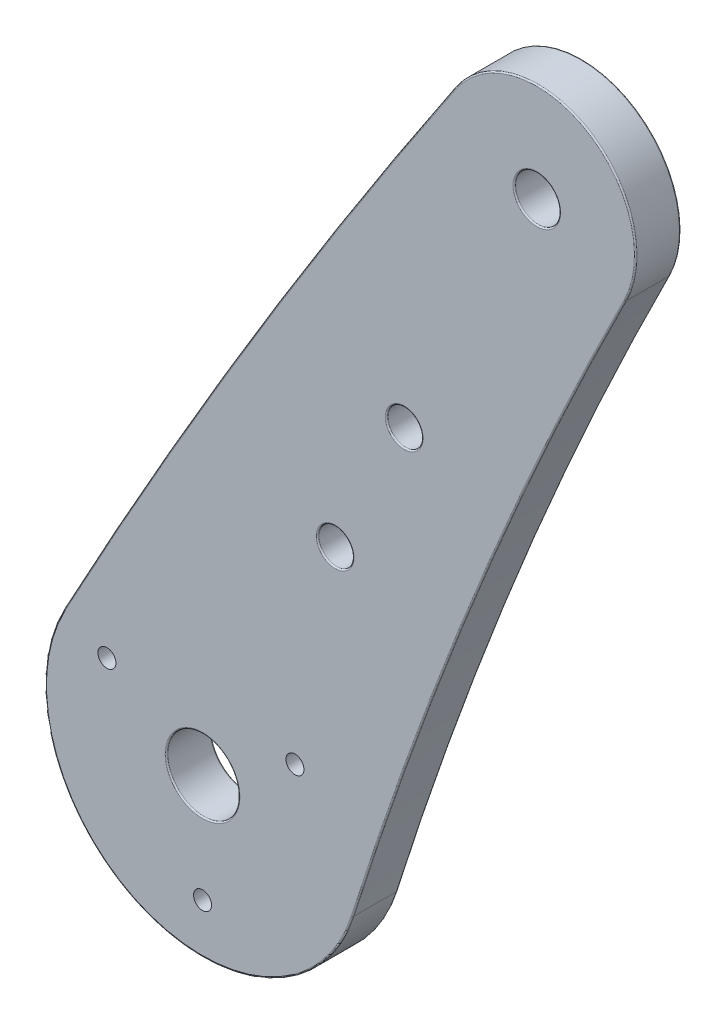
ISO-10303-21;
HEADER;
FILE_DESCRIPTION(('STEP AP214'),'2;1');
FILE_NAME('part.step','',(''),(''),'','','');
FILE_SCHEMA(('AUTOMOTIVE_DESIGN { 1 0 10303 214 1 1 1 1 }'));
ENDSEC;
DATA;
#1=APPLICATION_CONTEXT('core data for automotive mechanical design processes');
#2=APPLICATION_PROTOCOL_DEFINITION('international standard','automotive_design',2000,#1);
#3=PRODUCT_CONTEXT('',#1,'mechanical');
#4=PRODUCT('Part','Part','',(#3));
#5=PRODUCT_RELATED_PRODUCT_CATEGORY('part','',(#4));
#6=PRODUCT_DEFINITION_FORMATION('','',#4);
#7=PRODUCT_DEFINITION_CONTEXT('part definition',#1,'design');
#8=PRODUCT_DEFINITION('design','',#6,#7);
#9=PRODUCT_DEFINITION_SHAPE('','',#8);
#10=(LENGTH_UNIT() NAMED_UNIT(*) SI_UNIT(.MILLI.,.METRE.));
#11=(NAMED_UNIT(*) PLANE_ANGLE_UNIT() SI_UNIT($,.RADIAN.));
#12=(NAMED_UNIT(*) SI_UNIT($,.STERADIAN.) SOLID_ANGLE_UNIT());
#13=UNCERTAINTY_MEASURE_WITH_UNIT(LENGTH_MEASURE(1.E-05),#10,'distance_accuracy_value','');
#14=(GEOMETRIC_REPRESENTATION_CONTEXT(3) GLOBAL_UNCERTAINTY_ASSIGNED_CONTEXT((#13)) GLOBAL_UNIT_ASSIGNED_CONTEXT((#10,
#11,#12)) REPRESENTATION_CONTEXT('',''));
#15=CARTESIAN_POINT('',(0.,0.,0.));
#16=DIRECTION('',(0.,0.,1.));
#17=DIRECTION('',(1.,0.,0.));
#18=AXIS2_PLACEMENT_3D('',#15,#16,#17);
#19=CARTESIAN_POINT('',(245.064855305505,16.5895470184847,5.));
#20=DIRECTION('',(0.,0.,-1.));
#21=DIRECTION('',(-1.,0.,0.));
#22=AXIS2_PLACEMENT_3D('',#19,#20,#21);
#23=PLANE('',#22);
#24=CARTESIAN_POINT('',(-20.22,45.58,5.));
#25=DIRECTION('',(0.,0.,1.));
#26=DIRECTION('',(1.,0.,0.));
#27=AXIS2_PLACEMENT_3D('',#24,#25,#26);
#28=CIRCLE('',#27,1.00000000009273);
#29=CARTESIAN_POINT('',(-19.2199999999072,45.58,5.));
#30=VERTEX_POINT('',#29);
#31=EDGE_CURVE('E218',#30,#30,#28,.T.);
#32=ORIENTED_EDGE('',*,*,#31,.F.);
#33=EDGE_LOOP('',(#32));
#34=FACE_BOUND('',#33,.T.);
#35=CARTESIAN_POINT('',(-30.8485176670294,63.5800000000001,5.));
#36=DIRECTION('',(0.,0.,1.));
#37=DIRECTION('',(1.,0.,0.));
#38=AXIS2_PLACEMENT_3D('',#35,#36,#37);
#39=CIRCLE('',#38,1.00000000009272);
#40=CARTESIAN_POINT('',(-29.8485176669367,63.5800000000001,5.));
#41=VERTEX_POINT('',#40);
#42=EDGE_CURVE('E275',#41,#41,#39,.T.);
#43=ORIENTED_EDGE('',*,*,#42,.F.);
#44=EDGE_LOOP('',(#43));
#45=FACE_BOUND('',#44,.T.);
#46=CARTESIAN_POINT('',(-9.94580156539468,63.7845663042192,5.));
#47=DIRECTION('',(0.,0.,1.));
#48=DIRECTION('',(1.,0.,0.));
#49=AXIS2_PLACEMENT_3D('',#46,#47,#48);
#50=CIRCLE('',#49,1.00000000009271);
#51=CARTESIAN_POINT('',(-8.94580156530197,63.7845663042192,5.));
#52=VERTEX_POINT('',#51);
#53=EDGE_CURVE('E272',#52,#52,#50,.T.);
#54=ORIENTED_EDGE('',*,*,#53,.F.);
#55=EDGE_LOOP('',(#54));
#56=FACE_BOUND('',#55,.T.);
#57=CARTESIAN_POINT('',(-5.48245282163577,86.9566295398349,5.));
#58=DIRECTION('',(0.,0.,-1.));
#59=DIRECTION('',(-1.,0.,0.));
#60=AXIS2_PLACEMENT_3D('',#57,#58,#59);
#61=CIRCLE('',#60,2.09999999999999);
#62=CARTESIAN_POINT('',(-7.58245282163576,86.9566295398349,5.));
#63=VERTEX_POINT('',#62);
#64=EDGE_CURVE('E140',#63,#63,#61,.T.);
#65=ORIENTED_EDGE('',*,*,#64,.T.);
#66=EDGE_LOOP('',(#65));
#67=FACE_BOUND('',#66,.T.);
#68=CARTESIAN_POINT('',(2.20057844504618,102.271360039604,5.));
#69=DIRECTION('',(0.,0.,-1.));
#70=DIRECTION('',(-1.,0.,0.));
#71=AXIS2_PLACEMENT_3D('',#68,#69,#70);
#72=CIRCLE('',#71,2.09999999999999);
#73=CARTESIAN_POINT('',(0.100578445046185,102.271360039604,5.));
#74=VERTEX_POINT('',#73);
#75=EDGE_CURVE('E137',#74,#74,#72,.T.);
#76=ORIENTED_EDGE('',*,*,#75,.T.);
#77=EDGE_LOOP('',(#76));
#78=FACE_BOUND('',#77,.T.);
#79=CARTESIAN_POINT('',(16.9381256234104,131.647989579439,5.));
#80=DIRECTION('',(0.,0.,-1.));
#81=DIRECTION('',(-1.,0.,0.));
#82=AXIS2_PLACEMENT_3D('',#79,#80,#81);
#83=CIRCLE('',#82,2.65);
#84=CARTESIAN_POINT('',(14.2881256234104,131.647989579439,5.));
#85=VERTEX_POINT('',#84);
#86=EDGE_CURVE('E134',#85,#85,#83,.T.);
#87=ORIENTED_EDGE('',*,*,#86,.T.);
#88=EDGE_LOOP('',(#87));
#89=FACE_BOUND('',#88,.T.);
#90=CARTESIAN_POINT('',(473.1915849876,-98.4688955424697,5.));
#91=DIRECTION('',(0.,0.,-1.));
#92=DIRECTION('',(-1.,0.,0.));
#93=AXIS2_PLACEMENT_3D('',#90,#91,#92);
#94=CIRCLE('',#93,500.15);
#95=CARTESIAN_POINT('',(-3.6776019332659,52.3482157726341,5.));
#96=VERTEX_POINT('',#95);
#97=CARTESIAN_POINT('',(26.6256990756636,126.761946128221,5.));
#98=VERTEX_POINT('',#97);
#99=EDGE_CURVE('E104',#96,#98,#94,.T.);
#100=ORIENTED_EDGE('',*,*,#99,.T.);
#101=CARTESIAN_POINT('',(16.9381256234104,131.647989579439,5.));
#102=DIRECTION('',(0.,0.,-1.));
#103=DIRECTION('',(-1.,0.,0.));
#104=AXIS2_PLACEMENT_3D('',#101,#102,#103);
#105=CIRCLE('',#104,10.8499999999996);
#106=CARTESIAN_POINT('',(7.93969256073389,137.710225339991,5.));
#107=VERTEX_POINT('',#106);
#108=EDGE_CURVE('E132',#98,#107,#105,.F.);
#109=ORIENTED_EDGE('',*,*,#108,.T.);
#110=CARTESIAN_POINT('',(712.761659225801,-337.127660476196,5.));
#111=DIRECTION('',(0.,0.,-1.));
#112=DIRECTION('',(-1.,0.,0.));
#113=AXIS2_PLACEMENT_3D('',#110,#111,#112);
#114=CIRCLE('',#113,849.85);
#115=CARTESIAN_POINT('',(-35.4959540991803,65.8060395306448,5.));
#116=VERTEX_POINT('',#115);
#117=EDGE_CURVE('E107',#107,#116,#114,.F.);
#118=ORIENTED_EDGE('',*,*,#117,.T.);
#119=CARTESIAN_POINT('',(-20.2199999999999,57.5799999999999,5.));
#120=DIRECTION('',(0.,0.,-1.));
#121=DIRECTION('',(-1.,0.,0.));
#122=AXIS2_PLACEMENT_3D('',#119,#120,#121);
#123=CIRCLE('',#122,17.3499999999999);
#124=EDGE_CURVE('E99',#116,#96,#123,.F.);
#125=ORIENTED_EDGE('',*,*,#124,.T.);
#126=EDGE_LOOP('',(#100,#109,#118,#125));
#127=FACE_BOUND('',#126,.T.);
#128=CARTESIAN_POINT('',(-20.22,57.58,5.));
#129=DIRECTION('',(0.,0.,-1.));
#130=DIRECTION('',(-1.,0.,0.));
#131=AXIS2_PLACEMENT_3D('',#128,#129,#130);
#132=CIRCLE('',#131,4.15);
#133=CARTESIAN_POINT('',(-24.37,57.58,5.));
#134=VERTEX_POINT('',#133);
#135=EDGE_CURVE('E124',#134,#134,#132,.T.);
#136=ORIENTED_EDGE('',*,*,#135,.T.);
#137=EDGE_LOOP('',(#136));
#138=FACE_BOUND('',#137,.T.);
#139=ADVANCED_FACE('F33',(#34,#45,#56,#67,#78,#89,#127,#138),#23,.F.);
#140=CARTESIAN_POINT('',(245.064855305505,16.5895470184847,0.));
#141=DIRECTION('',(0.,0.,-1.));
#142=DIRECTION('',(-1.,0.,0.));
#143=AXIS2_PLACEMENT_3D('',#140,#141,#142);
#144=PLANE('',#143);
#145=CARTESIAN_POINT('',(-20.22,45.58,0.));
#146=DIRECTION('',(0.,0.,-1.));
#147=DIRECTION('',(-1.,0.,0.));
#148=AXIS2_PLACEMENT_3D('',#145,#146,#147);
#149=CIRCLE('',#148,1.00000000009273);
#150=CARTESIAN_POINT('',(-21.2200000000927,45.58,0.));
#151=VERTEX_POINT('',#150);
#152=EDGE_CURVE('E37',#151,#151,#149,.T.);
#153=ORIENTED_EDGE('',*,*,#152,.F.);
#154=EDGE_LOOP('',(#153));
#155=FACE_BOUND('',#154,.T.);
#156=CARTESIAN_POINT('',(-30.8485176670294,63.5800000000001,0.));
#157=DIRECTION('',(0.,0.,-1.));
#158=DIRECTION('',(-1.,0.,0.));
#159=AXIS2_PLACEMENT_3D('',#156,#157,#158);
#160=CIRCLE('',#159,1.00000000009272);
#161=CARTESIAN_POINT('',(-31.8485176671221,63.5800000000001,0.));
#162=VERTEX_POINT('',#161);
#163=EDGE_CURVE('E217',#162,#162,#160,.T.);
#164=ORIENTED_EDGE('',*,*,#163,.F.);
#165=EDGE_LOOP('',(#164));
#166=FACE_BOUND('',#165,.T.);
#167=CARTESIAN_POINT('',(-9.94580156539468,63.7845663042192,0.));
#168=DIRECTION('',(0.,0.,-1.));
#169=DIRECTION('',(-1.,0.,0.));
#170=AXIS2_PLACEMENT_3D('',#167,#168,#169);
#171=CIRCLE('',#170,1.00000000009271);
#172=CARTESIAN_POINT('',(-10.9458015654874,63.7845663042192,0.));
#173=VERTEX_POINT('',#172);
#174=EDGE_CURVE('E215',#173,#173,#171,.T.);
#175=ORIENTED_EDGE('',*,*,#174,.F.);
#176=EDGE_LOOP('',(#175));
#177=FACE_BOUND('',#176,.T.);
#178=CARTESIAN_POINT('',(2.20057844504618,102.271360039604,0.));
#179=DIRECTION('',(0.,0.,-1.));
#180=DIRECTION('',(-1.,0.,0.));
#181=AXIS2_PLACEMENT_3D('',#178,#179,#180);
#182=CIRCLE('',#181,2.09999999999999);
#183=CARTESIAN_POINT('',(0.100578445046185,102.271360039604,0.));
#184=VERTEX_POINT('',#183);
#185=EDGE_CURVE('E173',#184,#184,#182,.F.);
#186=ORIENTED_EDGE('',*,*,#185,.T.);
#187=EDGE_LOOP('',(#186));
#188=FACE_BOUND('',#187,.T.);
#189=CARTESIAN_POINT('',(-5.48245282163577,86.9566295398349,0.));
#190=DIRECTION('',(0.,0.,-1.));
#191=DIRECTION('',(-1.,0.,0.));
#192=AXIS2_PLACEMENT_3D('',#189,#190,#191);
#193=CIRCLE('',#192,2.09999999999999);
#194=CARTESIAN_POINT('',(-7.58245282163576,86.9566295398349,0.));
#195=VERTEX_POINT('',#194);
#196=EDGE_CURVE('E170',#195,#195,#193,.F.);
#197=ORIENTED_EDGE('',*,*,#196,.T.);
#198=EDGE_LOOP('',(#197));
#199=FACE_BOUND('',#198,.T.);
#200=CARTESIAN_POINT('',(16.9381256234104,131.647989579439,0.));
#201=DIRECTION('',(0.,0.,-1.));
#202=DIRECTION('',(-1.,0.,0.));
#203=AXIS2_PLACEMENT_3D('',#200,#201,#202);
#204=CIRCLE('',#203,2.65);
#205=CARTESIAN_POINT('',(14.2881256234104,131.647989579439,0.));
#206=VERTEX_POINT('',#205);
#207=EDGE_CURVE('E167',#206,#206,#204,.F.);
#208=ORIENTED_EDGE('',*,*,#207,.T.);
#209=EDGE_LOOP('',(#208));
#210=FACE_BOUND('',#209,.T.);
#211=CARTESIAN_POINT('',(-20.22,57.58,0.));
#212=DIRECTION('',(0.,0.,-1.));
#213=DIRECTION('',(-1.,0.,0.));
#214=AXIS2_PLACEMENT_3D('',#211,#212,#213);
#215=CIRCLE('',#214,4.15);
#216=CARTESIAN_POINT('',(-24.37,57.58,0.));
#217=VERTEX_POINT('',#216);
#218=EDGE_CURVE('E164',#217,#217,#215,.F.);
#219=ORIENTED_EDGE('',*,*,#218,.T.);
#220=EDGE_LOOP('',(#219));
#221=FACE_BOUND('',#220,.T.);
#222=CARTESIAN_POINT('',(712.761659225801,-337.127660476196,0.));
#223=DIRECTION('',(0.,0.,-1.));
#224=DIRECTION('',(-1.,0.,0.));
#225=AXIS2_PLACEMENT_3D('',#222,#223,#224);
#226=CIRCLE('',#225,849.85);
#227=CARTESIAN_POINT('',(-35.4959540991803,65.8060395306448,0.));
#228=VERTEX_POINT('',#227);
#229=CARTESIAN_POINT('',(7.93969256073389,137.710225339991,0.));
#230=VERTEX_POINT('',#229);
#231=EDGE_CURVE('E159',#228,#230,#226,.T.);
#232=ORIENTED_EDGE('',*,*,#231,.T.);
#233=CARTESIAN_POINT('',(16.9381256234104,131.647989579439,0.));
#234=DIRECTION('',(0.,0.,-1.));
#235=DIRECTION('',(-1.,0.,0.));
#236=AXIS2_PLACEMENT_3D('',#233,#234,#235);
#237=CIRCLE('',#236,10.8499999999996);
#238=CARTESIAN_POINT('',(26.6256990756636,126.761946128221,0.));
#239=VERTEX_POINT('',#238);
#240=EDGE_CURVE('E161',#230,#239,#237,.T.);
#241=ORIENTED_EDGE('',*,*,#240,.T.);
#242=CARTESIAN_POINT('',(473.1915849876,-98.4688955424697,0.));
#243=DIRECTION('',(0.,0.,-1.));
#244=DIRECTION('',(-1.,0.,0.));
#245=AXIS2_PLACEMENT_3D('',#242,#243,#244);
#246=CIRCLE('',#245,500.15);
#247=CARTESIAN_POINT('',(-3.6776019332659,52.3482157726341,0.));
#248=VERTEX_POINT('',#247);
#249=EDGE_CURVE('E155',#239,#248,#246,.F.);
#250=ORIENTED_EDGE('',*,*,#249,.T.);
#251=CARTESIAN_POINT('',(-20.2199999999999,57.5799999999999,0.));
#252=DIRECTION('',(0.,0.,-1.));
#253=DIRECTION('',(-1.,0.,0.));
#254=AXIS2_PLACEMENT_3D('',#251,#252,#253);
#255=CIRCLE('',#254,17.3499999999999);
#256=EDGE_CURVE('E157',#248,#228,#255,.T.);
#257=ORIENTED_EDGE('',*,*,#256,.T.);
#258=EDGE_LOOP('',(#232,#241,#250,#257));
#259=FACE_BOUND('',#258,.T.);
#260=ADVANCED_FACE('F228',(#155,#166,#177,#188,#199,#210,#221,#259),#144,.T.);
#261=CARTESIAN_POINT('',(16.9381256234104,131.647989579439,5.));
#262=DIRECTION('',(0.,0.,-1.));
#263=DIRECTION('',(-1.,0.,0.));
#264=AXIS2_PLACEMENT_3D('',#261,#262,#263);
#265=CYLINDRICAL_SURFACE('',#264,10.9999999999996);
#266=DIRECTION('',(0.,0.,-1.));
#267=VECTOR('',#266,1.);
#268=CARTESIAN_POINT('',(26.7596286625612,126.694397140416,5.));
#269=LINE('',#268,#267);
#270=CARTESIAN_POINT('',(26.7596286625612,126.694397140416,4.85));
#271=VERTEX_POINT('',#270);
#272=CARTESIAN_POINT('',(26.7596286625612,126.694397140416,0.15));
#273=VERTEX_POINT('',#272);
#274=EDGE_CURVE('E210',#271,#273,#269,.T.);
#275=ORIENTED_EDGE('',*,*,#274,.T.);
#276=CARTESIAN_POINT('',(16.9381256234104,131.647989579439,0.15));
#277=DIRECTION('',(0.,0.,-1.));
#278=DIRECTION('',(-1.,0.,0.));
#279=AXIS2_PLACEMENT_3D('',#276,#277,#278);
#280=CIRCLE('',#279,10.9999999999996);
#281=CARTESIAN_POINT('',(7.81529026032812,137.794035050967,0.15));
#282=VERTEX_POINT('',#281);
#283=EDGE_CURVE('E191',#273,#282,#280,.F.);
#284=ORIENTED_EDGE('',*,*,#283,.T.);
#285=DIRECTION('',(0.,0.,-1.));
#286=VECTOR('',#285,1.);
#287=CARTESIAN_POINT('',(7.81529026032812,137.794035050967,5.));
#288=LINE('',#287,#286);
#289=CARTESIAN_POINT('',(7.81529026032812,137.794035050967,4.85));
#290=VERTEX_POINT('',#289);
#291=EDGE_CURVE('E127',#290,#282,#288,.T.);
#292=ORIENTED_EDGE('',*,*,#291,.F.);
#293=CARTESIAN_POINT('',(16.9381256234104,131.647989579439,4.85));
#294=DIRECTION('',(0.,0.,-1.));
#295=DIRECTION('',(-1.,0.,0.));
#296=AXIS2_PLACEMENT_3D('',#293,#294,#295);
#297=CIRCLE('',#296,10.9999999999996);
#298=EDGE_CURVE('E188',#290,#271,#297,.T.);
#299=ORIENTED_EDGE('',*,*,#298,.T.);
#300=EDGE_LOOP('',(#275,#284,#292,#299));
#301=FACE_BOUND('',#300,.T.);
#302=ADVANCED_FACE('F231',(#301),#265,.T.);
#303=CARTESIAN_POINT('',(712.761659225801,-337.127660476196,5.));
#304=DIRECTION('',(0.,0.,-1.));
#305=DIRECTION('',(-1.,0.,0.));
#306=AXIS2_PLACEMENT_3D('',#303,#304,#305);
#307=CYLINDRICAL_SURFACE('',#306,850.);
#308=ORIENTED_EDGE('',*,*,#291,.T.);
#309=CARTESIAN_POINT('',(712.761659225801,-337.127660476196,0.15));
#310=DIRECTION('',(0.,0.,-1.));
#311=DIRECTION('',(-1.,0.,0.));
#312=AXIS2_PLACEMENT_3D('',#309,#310,#311);
#313=CIRCLE('',#312,850.);
#314=CARTESIAN_POINT('',(-35.6280228666082,65.8771580280277,0.15));
#315=VERTEX_POINT('',#314);
#316=EDGE_CURVE('E196',#282,#315,#313,.F.);
#317=ORIENTED_EDGE('',*,*,#316,.T.);
#318=DIRECTION('',(0.,0.,-1.));
#319=VECTOR('',#318,1.);
#320=CARTESIAN_POINT('',(-35.6280228666082,65.8771580280277,5.));
#321=LINE('',#320,#319);
#322=CARTESIAN_POINT('',(-35.6280228666082,65.8771580280277,4.85));
#323=VERTEX_POINT('',#322);
#324=EDGE_CURVE('E266',#323,#315,#321,.T.);
#325=ORIENTED_EDGE('',*,*,#324,.F.);
#326=CARTESIAN_POINT('',(712.761659225801,-337.127660476196,4.85));
#327=DIRECTION('',(0.,0.,-1.));
#328=DIRECTION('',(-1.,0.,0.));
#329=AXIS2_PLACEMENT_3D('',#326,#327,#328);
#330=CIRCLE('',#329,850.);
#331=EDGE_CURVE('E194',#323,#290,#330,.T.);
#332=ORIENTED_EDGE('',*,*,#331,.T.);
#333=EDGE_LOOP('',(#308,#317,#325,#332));
#334=FACE_BOUND('',#333,.T.);
#335=ADVANCED_FACE('F264',(#334),#307,.T.);
#336=CARTESIAN_POINT('',(-20.2199999999999,57.5799999999999,5.));
#337=DIRECTION('',(0.,0.,-1.));
#338=DIRECTION('',(-1.,0.,0.));
#339=AXIS2_PLACEMENT_3D('',#336,#337,#338);
#340=CYLINDRICAL_SURFACE('',#339,17.4999999999999);
#341=ORIENTED_EDGE('',*,*,#324,.T.);
#342=CARTESIAN_POINT('',(-20.2199999999999,57.5799999999999,0.15));
#343=DIRECTION('',(0.,0.,-1.));
#344=DIRECTION('',(-1.,0.,0.));
#345=AXIS2_PLACEMENT_3D('',#342,#343,#344);
#346=CIRCLE('',#345,17.4999999999999);
#347=CARTESIAN_POINT('',(-3.53458408254486,52.3029842087087,0.15));
#348=VERTEX_POINT('',#347);
#349=EDGE_CURVE('E50',#315,#348,#346,.F.);
#350=ORIENTED_EDGE('',*,*,#349,.T.);
#351=DIRECTION('',(0.,0.,-1.));
#352=VECTOR('',#351,1.);
#353=CARTESIAN_POINT('',(-3.53458408254486,52.3029842087087,5.));
#354=LINE('',#353,#352);
#355=CARTESIAN_POINT('',(-3.53458408254486,52.3029842087087,4.85));
#356=VERTEX_POINT('',#355);
#357=EDGE_CURVE('E267',#356,#348,#354,.T.);
#358=ORIENTED_EDGE('',*,*,#357,.F.);
#359=CARTESIAN_POINT('',(-20.2199999999999,57.5799999999999,4.85));
#360=DIRECTION('',(0.,0.,-1.));
#361=DIRECTION('',(-1.,0.,0.));
#362=AXIS2_PLACEMENT_3D('',#359,#360,#361);
#363=CIRCLE('',#362,17.4999999999999);
#364=EDGE_CURVE('E116',#356,#323,#363,.T.);
#365=ORIENTED_EDGE('',*,*,#364,.T.);
#366=EDGE_LOOP('',(#341,#350,#358,#365));
#367=FACE_BOUND('',#366,.T.);
#368=ADVANCED_FACE('F322',(#367),#340,.T.);
#369=CARTESIAN_POINT('',(473.1915849876,-98.4688955424697,5.));
#370=DIRECTION('',(0.,0.,-1.));
#371=DIRECTION('',(-1.,0.,0.));
#372=AXIS2_PLACEMENT_3D('',#369,#370,#371);
#373=CYLINDRICAL_SURFACE('',#372,500.);
#374=ORIENTED_EDGE('',*,*,#357,.T.);
#375=CARTESIAN_POINT('',(473.1915849876,-98.4688955424697,0.15));
#376=DIRECTION('',(0.,0.,-1.));
#377=DIRECTION('',(-1.,0.,0.));
#378=AXIS2_PLACEMENT_3D('',#375,#376,#377);
#379=CIRCLE('',#378,500.);
#380=EDGE_CURVE('E11',#348,#273,#379,.T.);
#381=ORIENTED_EDGE('',*,*,#380,.T.);
#382=ORIENTED_EDGE('',*,*,#274,.F.);
#383=CARTESIAN_POINT('',(473.1915849876,-98.4688955424697,4.85));
#384=DIRECTION('',(0.,0.,-1.));
#385=DIRECTION('',(-1.,0.,0.));
#386=AXIS2_PLACEMENT_3D('',#383,#384,#385);
#387=CIRCLE('',#386,500.);
#388=EDGE_CURVE('E42',#271,#356,#387,.F.);
#389=ORIENTED_EDGE('',*,*,#388,.T.);
#390=EDGE_LOOP('',(#374,#381,#382,#389));
#391=FACE_BOUND('',#390,.T.);
#392=ADVANCED_FACE('F315',(#391),#373,.F.);
#393=CARTESIAN_POINT('',(-20.22,57.58,5.));
#394=DIRECTION('',(0.,0.,-1.));
#395=DIRECTION('',(-1.,0.,0.));
#396=AXIS2_PLACEMENT_3D('',#393,#394,#395);
#397=CYLINDRICAL_SURFACE('',#396,4.);
#398=CARTESIAN_POINT('',(-20.22,57.58,0.15));
#399=DIRECTION('',(0.,0.,-1.));
#400=DIRECTION('',(-1.,0.,0.));
#401=AXIS2_PLACEMENT_3D('',#398,#399,#400);
#402=CIRCLE('',#401,4.);
#403=CARTESIAN_POINT('',(-24.22,57.58,0.15));
#404=VERTEX_POINT('',#403);
#405=EDGE_CURVE('E185',#404,#404,#402,.T.);
#406=ORIENTED_EDGE('',*,*,#405,.T.);
#407=EDGE_LOOP('',(#406));
#408=FACE_BOUND('',#407,.T.);
#409=CARTESIAN_POINT('',(-20.22,57.58,4.85));
#410=DIRECTION('',(0.,0.,-1.));
#411=DIRECTION('',(-1.,0.,0.));
#412=AXIS2_PLACEMENT_3D('',#409,#410,#411);
#413=CIRCLE('',#412,4.);
#414=CARTESIAN_POINT('',(-24.22,57.58,4.85));
#415=VERTEX_POINT('',#414);
#416=EDGE_CURVE('E182',#415,#415,#413,.F.);
#417=ORIENTED_EDGE('',*,*,#416,.T.);
#418=EDGE_LOOP('',(#417));
#419=FACE_BOUND('',#418,.T.);
#420=ADVANCED_FACE('F305',(#408,#419),#397,.F.);
#421=CARTESIAN_POINT('',(16.9381256234104,131.647989579439,5.));
#422=DIRECTION('',(0.,0.,-1.));
#423=DIRECTION('',(-1.,0.,0.));
#424=AXIS2_PLACEMENT_3D('',#421,#422,#423);
#425=CYLINDRICAL_SURFACE('',#424,2.5);
#426=CARTESIAN_POINT('',(16.9381256234104,131.647989579439,0.15));
#427=DIRECTION('',(0.,0.,-1.));
#428=DIRECTION('',(-1.,0.,0.));
#429=AXIS2_PLACEMENT_3D('',#426,#427,#428);
#430=CIRCLE('',#429,2.5);
#431=CARTESIAN_POINT('',(14.4381256234104,131.647989579439,0.15));
#432=VERTEX_POINT('',#431);
#433=EDGE_CURVE('E179',#432,#432,#430,.T.);
#434=ORIENTED_EDGE('',*,*,#433,.T.);
#435=EDGE_LOOP('',(#434));
#436=FACE_BOUND('',#435,.T.);
#437=CARTESIAN_POINT('',(16.9381256234104,131.647989579439,4.85));
#438=DIRECTION('',(0.,0.,-1.));
#439=DIRECTION('',(-1.,0.,0.));
#440=AXIS2_PLACEMENT_3D('',#437,#438,#439);
#441=CIRCLE('',#440,2.5);
#442=CARTESIAN_POINT('',(14.4381256234104,131.647989579439,4.85));
#443=VERTEX_POINT('',#442);
#444=EDGE_CURVE('E176',#443,#443,#441,.F.);
#445=ORIENTED_EDGE('',*,*,#444,.T.);
#446=EDGE_LOOP('',(#445));
#447=FACE_BOUND('',#446,.T.);
#448=ADVANCED_FACE('F302',(#436,#447),#425,.F.);
#449=CARTESIAN_POINT('',(-5.48245282163577,86.9566295398349,0.));
#450=DIRECTION('',(0.,0.,-1.));
#451=DIRECTION('',(-1.,0.,0.));
#452=AXIS2_PLACEMENT_3D('',#449,#450,#451);
#453=CYLINDRICAL_SURFACE('',#452,1.94999999999999);
#454=CARTESIAN_POINT('',(-5.48245282163577,86.9566295398349,4.85));
#455=DIRECTION('',(0.,0.,-1.));
#456=DIRECTION('',(-1.,0.,0.));
#457=AXIS2_PLACEMENT_3D('',#454,#455,#456);
#458=CIRCLE('',#457,1.94999999999999);
#459=CARTESIAN_POINT('',(-7.43245282163576,86.9566295398349,4.85));
#460=VERTEX_POINT('',#459);
#461=EDGE_CURVE('E146',#460,#460,#458,.F.);
#462=ORIENTED_EDGE('',*,*,#461,.T.);
#463=EDGE_LOOP('',(#462));
#464=FACE_BOUND('',#463,.T.);
#465=CARTESIAN_POINT('',(-5.48245282163577,86.9566295398349,0.15));
#466=DIRECTION('',(0.,0.,-1.));
#467=DIRECTION('',(-1.,0.,0.));
#468=AXIS2_PLACEMENT_3D('',#465,#466,#467);
#469=CIRCLE('',#468,1.94999999999999);
#470=CARTESIAN_POINT('',(-7.43245282163576,86.9566295398349,0.15));
#471=VERTEX_POINT('',#470);
#472=EDGE_CURVE('E143',#471,#471,#469,.T.);
#473=ORIENTED_EDGE('',*,*,#472,.T.);
#474=EDGE_LOOP('',(#473));
#475=FACE_BOUND('',#474,.T.);
#476=ADVANCED_FACE('F304',(#464,#475),#453,.F.);
#477=CARTESIAN_POINT('',(2.20057844504618,102.271360039604,0.));
#478=DIRECTION('',(0.,0.,-1.));
#479=DIRECTION('',(-1.,0.,0.));
#480=AXIS2_PLACEMENT_3D('',#477,#478,#479);
#481=CYLINDRICAL_SURFACE('',#480,1.94999999999999);
#482=CARTESIAN_POINT('',(2.20057844504618,102.271360039604,4.85));
#483=DIRECTION('',(0.,0.,-1.));
#484=DIRECTION('',(-1.,0.,0.));
#485=AXIS2_PLACEMENT_3D('',#482,#483,#484);
#486=CIRCLE('',#485,1.94999999999999);
#487=CARTESIAN_POINT('',(0.250578445046185,102.271360039604,4.85));
#488=VERTEX_POINT('',#487);
#489=EDGE_CURVE('E152',#488,#488,#486,.F.);
#490=ORIENTED_EDGE('',*,*,#489,.T.);
#491=EDGE_LOOP('',(#490));
#492=FACE_BOUND('',#491,.T.);
#493=CARTESIAN_POINT('',(2.20057844504618,102.271360039604,0.15));
#494=DIRECTION('',(0.,0.,-1.));
#495=DIRECTION('',(-1.,0.,0.));
#496=AXIS2_PLACEMENT_3D('',#493,#494,#495);
#497=CIRCLE('',#496,1.94999999999999);
#498=CARTESIAN_POINT('',(0.250578445046185,102.271360039604,0.15));
#499=VERTEX_POINT('',#498);
#500=EDGE_CURVE('E149',#499,#499,#497,.T.);
#501=ORIENTED_EDGE('',*,*,#500,.T.);
#502=EDGE_LOOP('',(#501));
#503=FACE_BOUND('',#502,.T.);
#504=ADVANCED_FACE('F312',(#492,#503),#481,.F.);
#505=CARTESIAN_POINT('',(-5.48245282163577,86.9566295398349,4.85));
#506=DIRECTION('',(0.,0.,-1.));
#507=DIRECTION('',(-1.,0.,0.));
#508=AXIS2_PLACEMENT_3D('',#505,#506,#507);
#509=TOROIDAL_SURFACE('',#508,2.09999999999999,0.15);
#510=ORIENTED_EDGE('',*,*,#461,.F.);
#511=EDGE_LOOP('',(#510));
#512=FACE_BOUND('',#511,.T.);
#513=ORIENTED_EDGE('',*,*,#64,.F.);
#514=EDGE_LOOP('',(#513));
#515=FACE_BOUND('',#514,.T.);
#516=ADVANCED_FACE('F329',(#512,#515),#509,.T.);
#517=CARTESIAN_POINT('',(2.20057844504618,102.271360039604,4.85));
#518=DIRECTION('',(0.,0.,-1.));
#519=DIRECTION('',(-1.,0.,0.));
#520=AXIS2_PLACEMENT_3D('',#517,#518,#519);
#521=TOROIDAL_SURFACE('',#520,2.09999999999999,0.15);
#522=ORIENTED_EDGE('',*,*,#489,.F.);
#523=EDGE_LOOP('',(#522));
#524=FACE_BOUND('',#523,.T.);
#525=ORIENTED_EDGE('',*,*,#75,.F.);
#526=EDGE_LOOP('',(#525));
#527=FACE_BOUND('',#526,.T.);
#528=ADVANCED_FACE('F332',(#524,#527),#521,.T.);
#529=CARTESIAN_POINT('',(2.20057844504618,102.271360039604,0.15));
#530=DIRECTION('',(0.,0.,-1.));
#531=DIRECTION('',(-1.,0.,0.));
#532=AXIS2_PLACEMENT_3D('',#529,#530,#531);
#533=TOROIDAL_SURFACE('',#532,2.09999999999999,0.15);
#534=ORIENTED_EDGE('',*,*,#185,.F.);
#535=EDGE_LOOP('',(#534));
#536=FACE_BOUND('',#535,.T.);
#537=ORIENTED_EDGE('',*,*,#500,.F.);
#538=EDGE_LOOP('',(#537));
#539=FACE_BOUND('',#538,.T.);
#540=ADVANCED_FACE('F336',(#536,#539),#533,.T.);
#541=CARTESIAN_POINT('',(-5.48245282163577,86.9566295398349,0.15));
#542=DIRECTION('',(0.,0.,-1.));
#543=DIRECTION('',(-1.,0.,0.));
#544=AXIS2_PLACEMENT_3D('',#541,#542,#543);
#545=TOROIDAL_SURFACE('',#544,2.09999999999999,0.15);
#546=ORIENTED_EDGE('',*,*,#196,.F.);
#547=EDGE_LOOP('',(#546));
#548=FACE_BOUND('',#547,.T.);
#549=ORIENTED_EDGE('',*,*,#472,.F.);
#550=EDGE_LOOP('',(#549));
#551=FACE_BOUND('',#550,.T.);
#552=ADVANCED_FACE('F340',(#548,#551),#545,.T.);
#553=CARTESIAN_POINT('',(16.9381256234104,131.647989579439,0.15));
#554=DIRECTION('',(0.,0.,-1.));
#555=DIRECTION('',(-1.,0.,0.));
#556=AXIS2_PLACEMENT_3D('',#553,#554,#555);
#557=TOROIDAL_SURFACE('',#556,2.65,0.15);
#558=ORIENTED_EDGE('',*,*,#433,.F.);
#559=EDGE_LOOP('',(#558));
#560=FACE_BOUND('',#559,.T.);
#561=ORIENTED_EDGE('',*,*,#207,.F.);
#562=EDGE_LOOP('',(#561));
#563=FACE_BOUND('',#562,.T.);
#564=ADVANCED_FACE('F298',(#560,#563),#557,.T.);
#565=CARTESIAN_POINT('',(16.9381256234104,131.647989579439,4.85));
#566=DIRECTION('',(0.,0.,-1.));
#567=DIRECTION('',(-1.,0.,0.));
#568=AXIS2_PLACEMENT_3D('',#565,#566,#567);
#569=TOROIDAL_SURFACE('',#568,2.65,0.15);
#570=ORIENTED_EDGE('',*,*,#86,.F.);
#571=EDGE_LOOP('',(#570));
#572=FACE_BOUND('',#571,.T.);
#573=ORIENTED_EDGE('',*,*,#444,.F.);
#574=EDGE_LOOP('',(#573));
#575=FACE_BOUND('',#574,.T.);
#576=ADVANCED_FACE('F294',(#572,#575),#569,.T.);
#577=CARTESIAN_POINT('',(-20.22,57.58,0.15));
#578=DIRECTION('',(0.,0.,-1.));
#579=DIRECTION('',(-1.,0.,0.));
#580=AXIS2_PLACEMENT_3D('',#577,#578,#579);
#581=TOROIDAL_SURFACE('',#580,4.15,0.15);
#582=ORIENTED_EDGE('',*,*,#405,.F.);
#583=EDGE_LOOP('',(#582));
#584=FACE_BOUND('',#583,.T.);
#585=ORIENTED_EDGE('',*,*,#218,.F.);
#586=EDGE_LOOP('',(#585));
#587=FACE_BOUND('',#586,.T.);
#588=ADVANCED_FACE('F297',(#584,#587),#581,.T.);
#589=CARTESIAN_POINT('',(-20.2199999999999,57.5799999999999,0.15));
#590=DIRECTION('',(0.,0.,-1.));
#591=DIRECTION('',(-1.,0.,0.));
#592=AXIS2_PLACEMENT_3D('',#589,#590,#591);
#593=TOROIDAL_SURFACE('',#592,17.3499999999999,0.15);
#594=CARTESIAN_POINT('',(-35.4959540991803,65.8060395306448,0.15));
#595=DIRECTION('',(0.474123315887343,0.88045844952047,0.));
#596=DIRECTION('',(-0.88045844952047,0.474123315887343,0.));
#597=AXIS2_PLACEMENT_3D('',#594,#595,#596);
#598=CIRCLE('',#597,0.15);
#599=EDGE_CURVE('E204',#228,#315,#598,.T.);
#600=ORIENTED_EDGE('',*,*,#599,.F.);
#601=ORIENTED_EDGE('',*,*,#256,.F.);
#602=CARTESIAN_POINT('',(-3.6776019332659,52.3482157726341,0.15));
#603=DIRECTION('',(0.301543759502339,0.953452338140295,0.));
#604=DIRECTION('',(-0.953452338140295,0.301543759502339,0.));
#605=AXIS2_PLACEMENT_3D('',#602,#603,#604);
#606=CIRCLE('',#605,0.15);
#607=EDGE_CURVE('E207',#348,#248,#606,.T.);
#608=ORIENTED_EDGE('',*,*,#607,.F.);
#609=ORIENTED_EDGE('',*,*,#349,.F.);
#610=EDGE_LOOP('',(#600,#601,#608,#609));
#611=FACE_BOUND('',#610,.T.);
#612=ADVANCED_FACE('F350',(#611),#593,.T.);
#613=CARTESIAN_POINT('',(473.1915849876,-98.4688955424697,0.15));
#614=DIRECTION('',(0.,0.,-1.));
#615=DIRECTION('',(-1.,0.,0.));
#616=AXIS2_PLACEMENT_3D('',#613,#614,#615);
#617=TOROIDAL_SURFACE('',#616,500.15,0.15);
#618=ORIENTED_EDGE('',*,*,#607,.T.);
#619=ORIENTED_EDGE('',*,*,#249,.F.);
#620=CARTESIAN_POINT('',(26.6256990756637,126.761946128221,0.15));
#621=DIRECTION('',(0.450326585365776,0.892863912650075,0.));
#622=DIRECTION('',(-0.892863912650075,0.450326585365776,0.));
#623=AXIS2_PLACEMENT_3D('',#620,#621,#622);
#624=CIRCLE('',#623,0.15);
#625=EDGE_CURVE('E202',#273,#239,#624,.T.);
#626=ORIENTED_EDGE('',*,*,#625,.F.);
#627=ORIENTED_EDGE('',*,*,#380,.F.);
#628=EDGE_LOOP('',(#618,#619,#626,#627));
#629=FACE_BOUND('',#628,.T.);
#630=ADVANCED_FACE('F356',(#629),#617,.T.);
#631=CARTESIAN_POINT('',(712.761659225801,-337.127660476196,0.15));
#632=DIRECTION('',(0.,0.,-1.));
#633=DIRECTION('',(-1.,0.,0.));
#634=AXIS2_PLACEMENT_3D('',#631,#632,#633);
#635=TOROIDAL_SURFACE('',#634,849.85,0.15);
#636=ORIENTED_EDGE('',*,*,#599,.T.);
#637=ORIENTED_EDGE('',*,*,#316,.F.);
#638=CARTESIAN_POINT('',(7.93969256073389,137.710225339991,0.15));
#639=DIRECTION('',(0.558731406502512,0.829348669371166,0.));
#640=DIRECTION('',(-0.829348669371167,0.558731406502512,0.));
#641=AXIS2_PLACEMENT_3D('',#638,#639,#640);
#642=CIRCLE('',#641,0.15);
#643=EDGE_CURVE('E118',#230,#282,#642,.T.);
#644=ORIENTED_EDGE('',*,*,#643,.F.);
#645=ORIENTED_EDGE('',*,*,#231,.F.);
#646=EDGE_LOOP('',(#636,#637,#644,#645));
#647=FACE_BOUND('',#646,.T.);
#648=ADVANCED_FACE('F256',(#647),#635,.T.);
#649=CARTESIAN_POINT('',(16.9381256234104,131.647989579439,0.15));
#650=DIRECTION('',(0.,0.,-1.));
#651=DIRECTION('',(-1.,0.,0.));
#652=AXIS2_PLACEMENT_3D('',#649,#650,#651);
#653=TOROIDAL_SURFACE('',#652,10.8499999999996,0.15);
#654=ORIENTED_EDGE('',*,*,#625,.T.);
#655=ORIENTED_EDGE('',*,*,#240,.F.);
#656=ORIENTED_EDGE('',*,*,#643,.T.);
#657=ORIENTED_EDGE('',*,*,#283,.F.);
#658=EDGE_LOOP('',(#654,#655,#656,#657));
#659=FACE_BOUND('',#658,.T.);
#660=ADVANCED_FACE('F251',(#659),#653,.T.);
#661=CARTESIAN_POINT('',(-20.2199999999999,57.5799999999999,4.85));
#662=DIRECTION('',(0.,0.,-1.));
#663=DIRECTION('',(-1.,0.,0.));
#664=AXIS2_PLACEMENT_3D('',#661,#662,#663);
#665=TOROIDAL_SURFACE('',#664,17.3499999999999,0.15);
#666=CARTESIAN_POINT('',(-35.4959540991803,65.8060395306448,4.85));
#667=DIRECTION('',(0.474123315887343,0.880458449520471,0.));
#668=DIRECTION('',(-0.880458449520471,0.474123315887343,0.));
#669=AXIS2_PLACEMENT_3D('',#666,#667,#668);
#670=CIRCLE('',#669,0.15);
#671=EDGE_CURVE('E119',#323,#116,#670,.T.);
#672=ORIENTED_EDGE('',*,*,#671,.F.);
#673=ORIENTED_EDGE('',*,*,#364,.F.);
#674=CARTESIAN_POINT('',(-3.6776019332659,52.3482157726341,4.85));
#675=DIRECTION('',(0.301543759502339,0.953452338140295,0.));
#676=DIRECTION('',(-0.953452338140295,0.301543759502339,0.));
#677=AXIS2_PLACEMENT_3D('',#674,#675,#676);
#678=CIRCLE('',#677,0.15);
#679=EDGE_CURVE('E114',#96,#356,#678,.T.);
#680=ORIENTED_EDGE('',*,*,#679,.F.);
#681=ORIENTED_EDGE('',*,*,#124,.F.);
#682=EDGE_LOOP('',(#672,#673,#680,#681));
#683=FACE_BOUND('',#682,.T.);
#684=ADVANCED_FACE('F115',(#683),#665,.T.);
#685=CARTESIAN_POINT('',(473.1915849876,-98.4688955424697,4.85));
#686=DIRECTION('',(0.,0.,-1.));
#687=DIRECTION('',(-1.,0.,0.));
#688=AXIS2_PLACEMENT_3D('',#685,#686,#687);
#689=TOROIDAL_SURFACE('',#688,500.15,0.15);
#690=ORIENTED_EDGE('',*,*,#679,.T.);
#691=ORIENTED_EDGE('',*,*,#388,.F.);
#692=CARTESIAN_POINT('',(26.6256990756636,126.761946128221,4.85));
#693=DIRECTION('',(0.450326585365793,0.892863912650066,0.));
#694=DIRECTION('',(-0.892863912650066,0.450326585365793,0.));
#695=AXIS2_PLACEMENT_3D('',#692,#693,#694);
#696=CIRCLE('',#695,0.15);
#697=EDGE_CURVE('E122',#98,#271,#696,.T.);
#698=ORIENTED_EDGE('',*,*,#697,.F.);
#699=ORIENTED_EDGE('',*,*,#99,.F.);
#700=EDGE_LOOP('',(#690,#691,#698,#699));
#701=FACE_BOUND('',#700,.T.);
#702=ADVANCED_FACE('F121',(#701),#689,.T.);
#703=CARTESIAN_POINT('',(712.761659225801,-337.127660476196,4.85));
#704=DIRECTION('',(0.,0.,-1.));
#705=DIRECTION('',(-1.,0.,0.));
#706=AXIS2_PLACEMENT_3D('',#703,#704,#705);
#707=TOROIDAL_SURFACE('',#706,849.85,0.15);
#708=ORIENTED_EDGE('',*,*,#671,.T.);
#709=ORIENTED_EDGE('',*,*,#117,.F.);
#710=CARTESIAN_POINT('',(7.9396925607338,137.710225339991,4.85));
#711=DIRECTION('',(0.558731406502536,0.82934866937115,0.));
#712=DIRECTION('',(-0.82934866937115,0.558731406502536,0.));
#713=AXIS2_PLACEMENT_3D('',#710,#711,#712);
#714=CIRCLE('',#713,0.15);
#715=EDGE_CURVE('E211',#290,#107,#714,.T.);
#716=ORIENTED_EDGE('',*,*,#715,.F.);
#717=ORIENTED_EDGE('',*,*,#331,.F.);
#718=EDGE_LOOP('',(#708,#709,#716,#717));
#719=FACE_BOUND('',#718,.T.);
#720=ADVANCED_FACE('F366',(#719),#707,.T.);
#721=CARTESIAN_POINT('',(16.9381256234104,131.647989579439,4.85));
#722=DIRECTION('',(0.,0.,-1.));
#723=DIRECTION('',(-1.,0.,0.));
#724=AXIS2_PLACEMENT_3D('',#721,#722,#723);
#725=TOROIDAL_SURFACE('',#724,10.8499999999996,0.15);
#726=ORIENTED_EDGE('',*,*,#697,.T.);
#727=ORIENTED_EDGE('',*,*,#298,.F.);
#728=ORIENTED_EDGE('',*,*,#715,.T.);
#729=ORIENTED_EDGE('',*,*,#108,.F.);
#730=EDGE_LOOP('',(#726,#727,#728,#729));
#731=FACE_BOUND('',#730,.T.);
#732=ADVANCED_FACE('F363',(#731),#725,.T.);
#733=CARTESIAN_POINT('',(-20.22,57.58,4.85));
#734=DIRECTION('',(0.,0.,-1.));
#735=DIRECTION('',(-1.,0.,0.));
#736=AXIS2_PLACEMENT_3D('',#733,#734,#735);
#737=TOROIDAL_SURFACE('',#736,4.15,0.15);
#738=ORIENTED_EDGE('',*,*,#135,.F.);
#739=EDGE_LOOP('',(#738));
#740=FACE_BOUND('',#739,.T.);
#741=ORIENTED_EDGE('',*,*,#416,.F.);
#742=EDGE_LOOP('',(#741));
#743=FACE_BOUND('',#742,.T.);
#744=ADVANCED_FACE('F35',(#740,#743),#737,.T.);
#745=CARTESIAN_POINT('',(-9.94580156539468,63.7845663042192,-5.));
#746=DIRECTION('',(0.,0.,1.));
#747=DIRECTION('',(1.,0.,0.));
#748=AXIS2_PLACEMENT_3D('',#745,#746,#747);
#749=CYLINDRICAL_SURFACE('',#748,1.00000000009271);
#750=ORIENTED_EDGE('',*,*,#174,.T.);
#751=EDGE_LOOP('',(#750));
#752=FACE_BOUND('',#751,.T.);
#753=ORIENTED_EDGE('',*,*,#53,.T.);
#754=EDGE_LOOP('',(#753));
#755=FACE_BOUND('',#754,.T.);
#756=ADVANCED_FACE('F395',(#752,#755),#749,.F.);
#757=CARTESIAN_POINT('',(-30.8485176670294,63.5800000000001,-5.));
#758=DIRECTION('',(0.,0.,1.));
#759=DIRECTION('',(1.,0.,0.));
#760=AXIS2_PLACEMENT_3D('',#757,#758,#759);
#761=CYLINDRICAL_SURFACE('',#760,1.00000000009272);
#762=ORIENTED_EDGE('',*,*,#163,.T.);
#763=EDGE_LOOP('',(#762));
#764=FACE_BOUND('',#763,.T.);
#765=ORIENTED_EDGE('',*,*,#42,.T.);
#766=EDGE_LOOP('',(#765));
#767=FACE_BOUND('',#766,.T.);
#768=ADVANCED_FACE('F403',(#764,#767),#761,.F.);
#769=CARTESIAN_POINT('',(-20.22,45.58,-5.));
#770=DIRECTION('',(0.,0.,1.));
#771=DIRECTION('',(1.,0.,0.));
#772=AXIS2_PLACEMENT_3D('',#769,#770,#771);
#773=CYLINDRICAL_SURFACE('',#772,1.00000000009273);
#774=ORIENTED_EDGE('',*,*,#152,.T.);
#775=EDGE_LOOP('',(#774));
#776=FACE_BOUND('',#775,.T.);
#777=ORIENTED_EDGE('',*,*,#31,.T.);
#778=EDGE_LOOP('',(#777));
#779=FACE_BOUND('',#778,.T.);
#780=ADVANCED_FACE('F225',(#776,#779),#773,.F.);
#781=CLOSED_SHELL('',(#139,#260,#302,#335,#368,#392,#420,#448,#476,#504,#516,#528,#540,#552,
#564,#576,#588,#612,#630,#648,#660,#684,#702,#720,#732,#744,#756,#768,#780));
#782=MANIFOLD_SOLID_BREP('B2',#781);
#783=ADVANCED_BREP_SHAPE_REPRESENTATION('',(#18,#782),#14);
#784=SHAPE_DEFINITION_REPRESENTATION(#9,#783);
ENDSEC;
END-ISO-10303-21;
